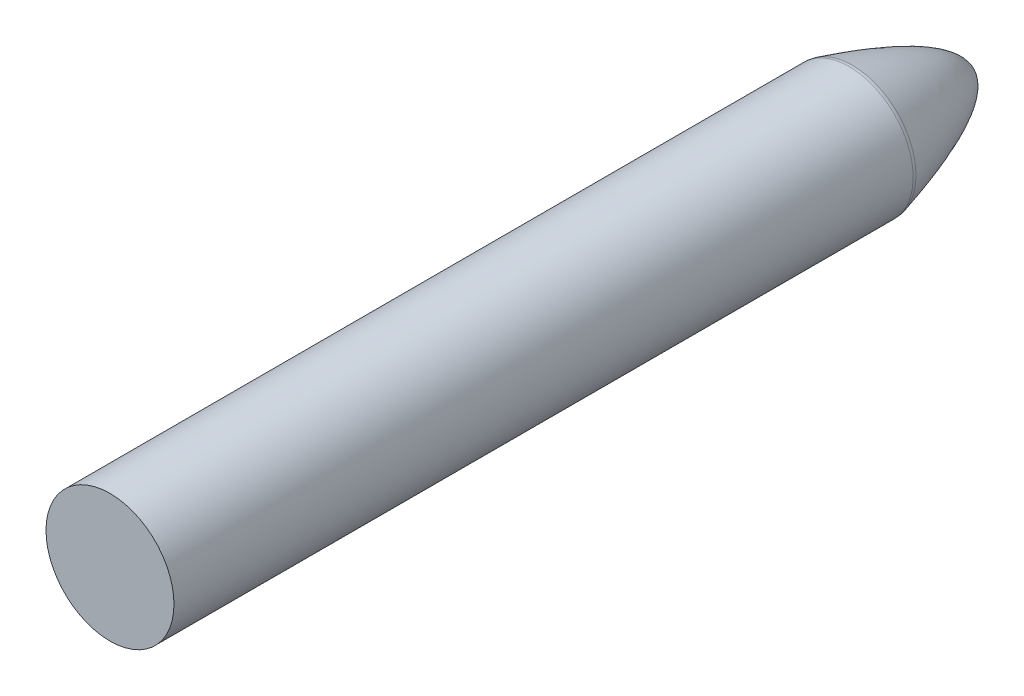
ISO-10303-21;
HEADER;
FILE_DESCRIPTION(('STEP AP214'),'2;1');
FILE_NAME('part.step','',(''),(''),'','','');
FILE_SCHEMA(('AUTOMOTIVE_DESIGN { 1 0 10303 214 1 1 1 1 }'));
ENDSEC;
DATA;
#1=APPLICATION_CONTEXT('core data for automotive mechanical design processes');
#2=APPLICATION_PROTOCOL_DEFINITION('international standard','automotive_design',2000,#1);
#3=PRODUCT_CONTEXT('',#1,'mechanical');
#4=PRODUCT('Part','Part','',(#3));
#5=PRODUCT_RELATED_PRODUCT_CATEGORY('part','',(#4));
#6=PRODUCT_DEFINITION_FORMATION('','',#4);
#7=PRODUCT_DEFINITION_CONTEXT('part definition',#1,'design');
#8=PRODUCT_DEFINITION('design','',#6,#7);
#9=PRODUCT_DEFINITION_SHAPE('','',#8);
#10=(LENGTH_UNIT() NAMED_UNIT(*) SI_UNIT(.MILLI.,.METRE.));
#11=(NAMED_UNIT(*) PLANE_ANGLE_UNIT() SI_UNIT($,.RADIAN.));
#12=(NAMED_UNIT(*) SI_UNIT($,.STERADIAN.) SOLID_ANGLE_UNIT());
#13=UNCERTAINTY_MEASURE_WITH_UNIT(LENGTH_MEASURE(1.E-05),#10,'distance_accuracy_value','');
#14=(GEOMETRIC_REPRESENTATION_CONTEXT(3) GLOBAL_UNCERTAINTY_ASSIGNED_CONTEXT((#13)) GLOBAL_UNIT_ASSIGNED_CONTEXT((#10,
#11,#12)) REPRESENTATION_CONTEXT('',''));
#15=CARTESIAN_POINT('',(0.,0.,0.));
#16=DIRECTION('',(0.,0.,1.));
#17=DIRECTION('',(1.,0.,0.));
#18=AXIS2_PLACEMENT_3D('',#15,#16,#17);
#19=CARTESIAN_POINT('',(0.,0.,-9400.));
#20=CARTESIAN_POINT('',(-648.579880214746,0.,-9399.03180091401));
#21=CARTESIAN_POINT('',(-1295.3698485275,0.,-7000.));
#22=B_SPLINE_CURVE_WITH_KNOTS('',2,(#19,#20,#21),.UNSPECIFIED.,.F.,.F.,(3,3),(0.,
0.499798210451895),.UNSPECIFIED.);
#23=CARTESIAN_POINT('',(-2.22044604925031E-13,0.,-7000.));
#24=DIRECTION('',(0.,0.,1.));
#25=AXIS1_PLACEMENT('',#23,#24);
#26=SURFACE_OF_REVOLUTION('',#22,#25);
#27=CARTESIAN_POINT('',(-2.19058769730314E-13,0.,-7032.27281504877));
#28=DIRECTION('',(0.,0.,1.));
#29=DIRECTION('',(1.,0.,0.));
#30=AXIS2_PLACEMENT_3D('',#27,#28,#29);
#31=CIRCLE('',#30,1286.63941956719);
#32=CARTESIAN_POINT('',(1286.63941956719,0.,-7032.27281504877));
#33=VERTEX_POINT('',#32);
#34=EDGE_CURVE('E11',#33,#33,#31,.F.);
#35=ORIENTED_EDGE('',*,*,#34,.T.);
#36=EDGE_LOOP('',(#35));
#37=FACE_BOUND('',#36,.T.);
#38=CARTESIAN_POINT('',(0.,0.,-9400.));
#39=VERTEX_POINT('',#38);
#40=VERTEX_LOOP('',#39);
#41=FACE_BOUND('',#40,.T.);
#42=ADVANCED_FACE('F33',(#37,#41),#26,.T.);
#43=CARTESIAN_POINT('',(0.,0.,8000.));
#44=DIRECTION('',(0.,0.,-1.));
#45=DIRECTION('',(-1.,0.,0.));
#46=AXIS2_PLACEMENT_3D('',#43,#44,#45);
#47=CYLINDRICAL_SURFACE('',#46,1295.3698485275);
#48=CARTESIAN_POINT('',(0.,0.,-6966.78240284726));
#49=DIRECTION('',(0.,0.,-1.));
#50=DIRECTION('',(-1.,0.,0.));
#51=AXIS2_PLACEMENT_3D('',#48,#49,#50);
#52=CIRCLE('',#51,1295.3698485275);
#53=CARTESIAN_POINT('',(-1295.3698485275,0.,-6966.78240284726));
#54=VERTEX_POINT('',#53);
#55=EDGE_CURVE('E40',#54,#54,#52,.F.);
#56=ORIENTED_EDGE('',*,*,#55,.T.);
#57=EDGE_LOOP('',(#56));
#58=FACE_BOUND('',#57,.T.);
#59=CARTESIAN_POINT('',(0.,0.,8000.));
#60=DIRECTION('',(0.,0.,1.));
#61=DIRECTION('',(1.,0.,0.));
#62=AXIS2_PLACEMENT_3D('',#59,#60,#61);
#63=CIRCLE('',#62,1295.3698485275);
#64=CARTESIAN_POINT('',(1295.3698485275,0.,8000.));
#65=VERTEX_POINT('',#64);
#66=EDGE_CURVE('E58',#65,#65,#63,.T.);
#67=ORIENTED_EDGE('',*,*,#66,.F.);
#68=EDGE_LOOP('',(#67));
#69=FACE_BOUND('',#68,.T.);
#70=ADVANCED_FACE('F44',(#58,#69),#47,.T.);
#71=CARTESIAN_POINT('',(0.,0.,8000.));
#72=DIRECTION('',(0.,0.,1.));
#73=DIRECTION('',(1.,0.,0.));
#74=AXIS2_PLACEMENT_3D('',#71,#72,#73);
#75=PLANE('',#74);
#76=ORIENTED_EDGE('',*,*,#66,.T.);
#77=EDGE_LOOP('',(#76));
#78=FACE_BOUND('',#77,.T.);
#79=ADVANCED_FACE('F49',(#78),#75,.T.);
#80=CARTESIAN_POINT('',(2.34385770183609E-13,0.,-6966.78240284726));
#81=DIRECTION('',(0.,0.,-1.));
#82=DIRECTION('',(-1.,0.,0.));
#83=AXIS2_PLACEMENT_3D('',#80,#81,#82);
#84=TOROIDAL_SURFACE('',#83,1045.3698485275,250.);
#85=ORIENTED_EDGE('',*,*,#34,.F.);
#86=EDGE_LOOP('',(#85));
#87=FACE_BOUND('',#86,.T.);
#88=ORIENTED_EDGE('',*,*,#55,.F.);
#89=EDGE_LOOP('',(#88));
#90=FACE_BOUND('',#89,.T.);
#91=ADVANCED_FACE('F35',(#87,#90),#84,.T.);
#92=CLOSED_SHELL('',(#42,#70,#79,#91));
#93=MANIFOLD_SOLID_BREP('B2',#92);
#94=ADVANCED_BREP_SHAPE_REPRESENTATION('',(#18,#93),#14);
#95=SHAPE_DEFINITION_REPRESENTATION(#9,#94);
ENDSEC;
END-ISO-10303-21;
